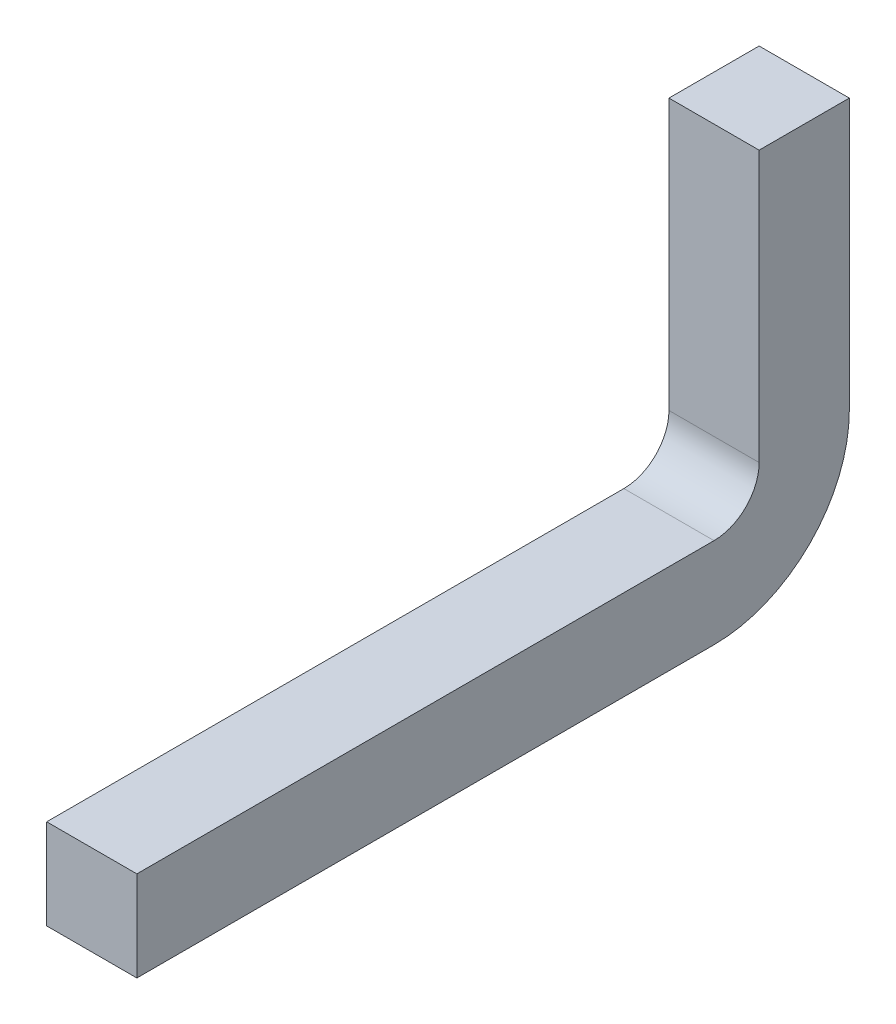
ISO-10303-21;
HEADER;
FILE_DESCRIPTION(('STEP AP214'),'2;1');
FILE_NAME('part.step','',(''),(''),'','','');
FILE_SCHEMA(('AUTOMOTIVE_DESIGN { 1 0 10303 214 1 1 1 1 }'));
ENDSEC;
DATA;
#1=APPLICATION_CONTEXT('core data for automotive mechanical design processes');
#2=APPLICATION_PROTOCOL_DEFINITION('international standard','automotive_design',2000,#1);
#3=PRODUCT_CONTEXT('',#1,'mechanical');
#4=PRODUCT('Part','Part','',(#3));
#5=PRODUCT_RELATED_PRODUCT_CATEGORY('part','',(#4));
#6=PRODUCT_DEFINITION_FORMATION('','',#4);
#7=PRODUCT_DEFINITION_CONTEXT('part definition',#1,'design');
#8=PRODUCT_DEFINITION('design','',#6,#7);
#9=PRODUCT_DEFINITION_SHAPE('','',#8);
#10=(LENGTH_UNIT() NAMED_UNIT(*) SI_UNIT(.MILLI.,.METRE.));
#11=(NAMED_UNIT(*) PLANE_ANGLE_UNIT() SI_UNIT($,.RADIAN.));
#12=(NAMED_UNIT(*) SI_UNIT($,.STERADIAN.) SOLID_ANGLE_UNIT());
#13=UNCERTAINTY_MEASURE_WITH_UNIT(LENGTH_MEASURE(1.E-05),#10,'distance_accuracy_value','');
#14=(GEOMETRIC_REPRESENTATION_CONTEXT(3) GLOBAL_UNCERTAINTY_ASSIGNED_CONTEXT((#13)) GLOBAL_UNIT_ASSIGNED_CONTEXT((#10,
#11,#12)) REPRESENTATION_CONTEXT('',''));
#15=CARTESIAN_POINT('',(0.,0.,0.));
#16=DIRECTION('',(0.,0.,1.));
#17=DIRECTION('',(1.,0.,0.));
#18=AXIS2_PLACEMENT_3D('',#15,#16,#17);
#19=CARTESIAN_POINT('',(0.1,3.914738184594,-0.962544486012));
#20=DIRECTION('',(1.,0.,0.));
#21=DIRECTION('',(0.,1.,0.));
#22=AXIS2_PLACEMENT_3D('',#19,#20,#21);
#23=PLANE('',#22);
#24=DIRECTION('',(0.,-1.,0.));
#25=VECTOR('',#24,1.);
#26=CARTESIAN_POINT('',(0.1,3.65,0.));
#27=LINE('',#26,#25);
#28=CARTESIAN_POINT('',(0.1,3.65,0.));
#29=VERTEX_POINT('',#28);
#30=CARTESIAN_POINT('',(0.1,3.85,0.));
#31=VERTEX_POINT('',#30);
#32=EDGE_CURVE('E106',#29,#31,#27,.F.);
#33=ORIENTED_EDGE('',*,*,#32,.F.);
#34=DIRECTION('',(0.,0.,1.));
#35=VECTOR('',#34,1.);
#36=CARTESIAN_POINT('',(0.1,3.65,-1.28));
#37=LINE('',#36,#35);
#38=CARTESIAN_POINT('',(0.0999999999999999,3.65,-1.28));
#39=VERTEX_POINT('',#38);
#40=EDGE_CURVE('E92',#39,#29,#37,.T.);
#41=ORIENTED_EDGE('',*,*,#40,.F.);
#42=CARTESIAN_POINT('',(0.0999999999999999,3.95,-1.28));
#43=DIRECTION('',(-1.,0.,0.));
#44=DIRECTION('',(0.,0.,1.));
#45=AXIS2_PLACEMENT_3D('',#42,#43,#44);
#46=CIRCLE('',#45,0.3);
#47=CARTESIAN_POINT('',(0.1,3.95,-1.58));
#48=VERTEX_POINT('',#47);
#49=EDGE_CURVE('E20',#48,#39,#46,.T.);
#50=ORIENTED_EDGE('',*,*,#49,.F.);
#51=DIRECTION('',(0.,1.,0.));
#52=VECTOR('',#51,1.);
#53=CARTESIAN_POINT('',(0.1,4.55,-1.58));
#54=LINE('',#53,#52);
#55=CARTESIAN_POINT('',(0.1,4.55,-1.58));
#56=VERTEX_POINT('',#55);
#57=EDGE_CURVE('E78',#56,#48,#54,.F.);
#58=ORIENTED_EDGE('',*,*,#57,.F.);
#59=DIRECTION('',(0.,0.,1.));
#60=VECTOR('',#59,1.);
#61=CARTESIAN_POINT('',(0.1,4.55,-1.38));
#62=LINE('',#61,#60);
#63=CARTESIAN_POINT('',(0.1,4.55,-1.38));
#64=VERTEX_POINT('',#63);
#65=EDGE_CURVE('E99',#64,#56,#62,.F.);
#66=ORIENTED_EDGE('',*,*,#65,.F.);
#67=DIRECTION('',(0.,-1.,0.));
#68=VECTOR('',#67,1.);
#69=CARTESIAN_POINT('',(0.1,3.95,-1.38));
#70=LINE('',#69,#68);
#71=CARTESIAN_POINT('',(0.1,3.95,-1.38));
#72=VERTEX_POINT('',#71);
#73=EDGE_CURVE('E121',#72,#64,#70,.F.);
#74=ORIENTED_EDGE('',*,*,#73,.F.);
#75=CARTESIAN_POINT('',(0.1,3.95,-1.28));
#76=DIRECTION('',(-1.,0.,0.));
#77=DIRECTION('',(0.,0.,1.));
#78=AXIS2_PLACEMENT_3D('',#75,#76,#77);
#79=CIRCLE('',#78,0.1);
#80=CARTESIAN_POINT('',(0.1,3.85,-1.28));
#81=VERTEX_POINT('',#80);
#82=EDGE_CURVE('E118',#72,#81,#79,.T.);
#83=ORIENTED_EDGE('',*,*,#82,.T.);
#84=DIRECTION('',(0.,0.,1.));
#85=VECTOR('',#84,1.);
#86=CARTESIAN_POINT('',(0.1,3.85,0.));
#87=LINE('',#86,#85);
#88=EDGE_CURVE('E116',#31,#81,#87,.F.);
#89=ORIENTED_EDGE('',*,*,#88,.F.);
#90=EDGE_LOOP('',(#33,#41,#50,#58,#66,#74,#83,#89));
#91=FACE_BOUND('',#90,.T.);
#92=ADVANCED_FACE('F17',(#91),#23,.T.);
#93=CARTESIAN_POINT('',(-0.1,3.95,-1.28));
#94=DIRECTION('',(-1.,0.,0.));
#95=DIRECTION('',(0.,0.,1.));
#96=AXIS2_PLACEMENT_3D('',#93,#94,#95);
#97=CYLINDRICAL_SURFACE('',#96,0.3);
#98=ORIENTED_EDGE('',*,*,#49,.T.);
#99=DIRECTION('',(1.,0.,0.));
#100=VECTOR('',#99,1.);
#101=CARTESIAN_POINT('',(-0.1,3.65,-1.28));
#102=LINE('',#101,#100);
#103=CARTESIAN_POINT('',(-0.1,3.65,-1.28));
#104=VERTEX_POINT('',#103);
#105=EDGE_CURVE('E113',#104,#39,#102,.T.);
#106=ORIENTED_EDGE('',*,*,#105,.F.);
#107=CARTESIAN_POINT('',(-0.1,3.95,-1.28));
#108=DIRECTION('',(-1.,0.,0.));
#109=DIRECTION('',(0.,0.,1.));
#110=AXIS2_PLACEMENT_3D('',#107,#108,#109);
#111=CIRCLE('',#110,0.3);
#112=CARTESIAN_POINT('',(-0.1,3.95,-1.58));
#113=VERTEX_POINT('',#112);
#114=EDGE_CURVE('E98',#104,#113,#111,.F.);
#115=ORIENTED_EDGE('',*,*,#114,.T.);
#116=DIRECTION('',(1.,0.,0.));
#117=VECTOR('',#116,1.);
#118=CARTESIAN_POINT('',(-0.1,3.95,-1.58));
#119=LINE('',#118,#117);
#120=EDGE_CURVE('E83',#48,#113,#119,.F.);
#121=ORIENTED_EDGE('',*,*,#120,.F.);
#122=EDGE_LOOP('',(#98,#106,#115,#121));
#123=FACE_BOUND('',#122,.T.);
#124=ADVANCED_FACE('F97',(#123),#97,.T.);
#125=CARTESIAN_POINT('',(-0.1,4.55,-1.58));
#126=DIRECTION('',(0.,0.,-1.));
#127=DIRECTION('',(0.,1.,0.));
#128=AXIS2_PLACEMENT_3D('',#125,#126,#127);
#129=PLANE('',#128);
#130=ORIENTED_EDGE('',*,*,#120,.T.);
#131=DIRECTION('',(0.,1.,0.));
#132=VECTOR('',#131,1.);
#133=CARTESIAN_POINT('',(-0.1,3.914738184594,-1.58));
#134=LINE('',#133,#132);
#135=CARTESIAN_POINT('',(-0.0999999999999999,4.55,-1.58));
#136=VERTEX_POINT('',#135);
#137=EDGE_CURVE('E135',#113,#136,#134,.T.);
#138=ORIENTED_EDGE('',*,*,#137,.T.);
#139=DIRECTION('',(-1.,0.,0.));
#140=VECTOR('',#139,1.);
#141=CARTESIAN_POINT('',(-0.1,4.55,-1.58));
#142=LINE('',#141,#140);
#143=EDGE_CURVE('E85',#56,#136,#142,.T.);
#144=ORIENTED_EDGE('',*,*,#143,.F.);
#145=ORIENTED_EDGE('',*,*,#57,.T.);
#146=EDGE_LOOP('',(#130,#138,#144,#145));
#147=FACE_BOUND('',#146,.T.);
#148=ADVANCED_FACE('F80',(#147),#129,.T.);
#149=CARTESIAN_POINT('',(-0.1,4.55,-1.38));
#150=DIRECTION('',(0.,1.,0.));
#151=DIRECTION('',(-1.,0.,0.));
#152=AXIS2_PLACEMENT_3D('',#149,#150,#151);
#153=PLANE('',#152);
#154=ORIENTED_EDGE('',*,*,#143,.T.);
#155=DIRECTION('',(0.,0.,1.));
#156=VECTOR('',#155,1.);
#157=CARTESIAN_POINT('',(-0.0999999999999999,4.55,-0.962544486012));
#158=LINE('',#157,#156);
#159=CARTESIAN_POINT('',(-0.0999999999999999,4.55,-1.38));
#160=VERTEX_POINT('',#159);
#161=EDGE_CURVE('E151',#136,#160,#158,.T.);
#162=ORIENTED_EDGE('',*,*,#161,.T.);
#163=DIRECTION('',(1.,0.,0.));
#164=VECTOR('',#163,1.);
#165=CARTESIAN_POINT('',(-0.1,4.55,-1.38));
#166=LINE('',#165,#164);
#167=EDGE_CURVE('E123',#64,#160,#166,.F.);
#168=ORIENTED_EDGE('',*,*,#167,.F.);
#169=ORIENTED_EDGE('',*,*,#65,.T.);
#170=EDGE_LOOP('',(#154,#162,#168,#169));
#171=FACE_BOUND('',#170,.T.);
#172=ADVANCED_FACE('F157',(#171),#153,.T.);
#173=CARTESIAN_POINT('',(-0.1,3.95,-1.38));
#174=DIRECTION('',(0.,0.,1.));
#175=DIRECTION('',(0.,-1.,0.));
#176=AXIS2_PLACEMENT_3D('',#173,#174,#175);
#177=PLANE('',#176);
#178=ORIENTED_EDGE('',*,*,#167,.T.);
#179=DIRECTION('',(0.,1.,0.));
#180=VECTOR('',#179,1.);
#181=CARTESIAN_POINT('',(-0.1,3.914738184594,-1.38));
#182=LINE('',#181,#180);
#183=CARTESIAN_POINT('',(-0.1,3.95,-1.38));
#184=VERTEX_POINT('',#183);
#185=EDGE_CURVE('E134',#160,#184,#182,.F.);
#186=ORIENTED_EDGE('',*,*,#185,.T.);
#187=DIRECTION('',(-1.,0.,0.));
#188=VECTOR('',#187,1.);
#189=CARTESIAN_POINT('',(-0.1,3.95,-1.38));
#190=LINE('',#189,#188);
#191=EDGE_CURVE('E137',#184,#72,#190,.F.);
#192=ORIENTED_EDGE('',*,*,#191,.T.);
#193=ORIENTED_EDGE('',*,*,#73,.T.);
#194=EDGE_LOOP('',(#178,#186,#192,#193));
#195=FACE_BOUND('',#194,.T.);
#196=ADVANCED_FACE('F192',(#195),#177,.T.);
#197=CARTESIAN_POINT('',(-0.1,3.95,-1.28));
#198=DIRECTION('',(-1.,0.,0.));
#199=DIRECTION('',(0.,0.,1.));
#200=AXIS2_PLACEMENT_3D('',#197,#198,#199);
#201=CYLINDRICAL_SURFACE('',#200,0.1);
#202=ORIENTED_EDGE('',*,*,#82,.F.);
#203=ORIENTED_EDGE('',*,*,#191,.F.);
#204=CARTESIAN_POINT('',(-0.1,3.95,-1.28));
#205=DIRECTION('',(-1.,0.,0.));
#206=DIRECTION('',(0.,0.,1.));
#207=AXIS2_PLACEMENT_3D('',#204,#205,#206);
#208=CIRCLE('',#207,0.1);
#209=CARTESIAN_POINT('',(-0.1,3.85,-1.28));
#210=VERTEX_POINT('',#209);
#211=EDGE_CURVE('E130',#184,#210,#208,.T.);
#212=ORIENTED_EDGE('',*,*,#211,.T.);
#213=DIRECTION('',(-1.,0.,0.));
#214=VECTOR('',#213,1.);
#215=CARTESIAN_POINT('',(-0.1,3.85,-1.28));
#216=LINE('',#215,#214);
#217=EDGE_CURVE('E109',#81,#210,#216,.T.);
#218=ORIENTED_EDGE('',*,*,#217,.F.);
#219=EDGE_LOOP('',(#202,#203,#212,#218));
#220=FACE_BOUND('',#219,.T.);
#221=ADVANCED_FACE('F194',(#220),#201,.F.);
#222=CARTESIAN_POINT('',(-0.1,3.85,0.));
#223=DIRECTION('',(0.,1.,0.));
#224=DIRECTION('',(-1.,0.,0.));
#225=AXIS2_PLACEMENT_3D('',#222,#223,#224);
#226=PLANE('',#225);
#227=ORIENTED_EDGE('',*,*,#217,.T.);
#228=DIRECTION('',(0.,0.,1.));
#229=VECTOR('',#228,1.);
#230=CARTESIAN_POINT('',(-0.1,3.85,-0.962544486012));
#231=LINE('',#230,#229);
#232=CARTESIAN_POINT('',(-0.0999999999999999,3.85,0.));
#233=VERTEX_POINT('',#232);
#234=EDGE_CURVE('E133',#210,#233,#231,.T.);
#235=ORIENTED_EDGE('',*,*,#234,.T.);
#236=DIRECTION('',(1.,0.,0.));
#237=VECTOR('',#236,1.);
#238=CARTESIAN_POINT('',(-0.1,3.85,0.));
#239=LINE('',#238,#237);
#240=EDGE_CURVE('E108',#31,#233,#239,.F.);
#241=ORIENTED_EDGE('',*,*,#240,.F.);
#242=ORIENTED_EDGE('',*,*,#88,.T.);
#243=EDGE_LOOP('',(#227,#235,#241,#242));
#244=FACE_BOUND('',#243,.T.);
#245=ADVANCED_FACE('F186',(#244),#226,.T.);
#246=CARTESIAN_POINT('',(-0.1,3.65,0.));
#247=DIRECTION('',(0.,0.,1.));
#248=DIRECTION('',(0.,-1.,0.));
#249=AXIS2_PLACEMENT_3D('',#246,#247,#248);
#250=PLANE('',#249);
#251=ORIENTED_EDGE('',*,*,#240,.T.);
#252=DIRECTION('',(0.,1.,0.));
#253=VECTOR('',#252,1.);
#254=CARTESIAN_POINT('',(-0.0999999999999999,3.914738184594,0.));
#255=LINE('',#254,#253);
#256=CARTESIAN_POINT('',(-0.1,3.65,0.));
#257=VERTEX_POINT('',#256);
#258=EDGE_CURVE('E26',#233,#257,#255,.F.);
#259=ORIENTED_EDGE('',*,*,#258,.T.);
#260=DIRECTION('',(1.,0.,0.));
#261=VECTOR('',#260,1.);
#262=CARTESIAN_POINT('',(-0.1,3.65,0.));
#263=LINE('',#262,#261);
#264=EDGE_CURVE('E34',#29,#257,#263,.F.);
#265=ORIENTED_EDGE('',*,*,#264,.F.);
#266=ORIENTED_EDGE('',*,*,#32,.T.);
#267=EDGE_LOOP('',(#251,#259,#265,#266));
#268=FACE_BOUND('',#267,.T.);
#269=ADVANCED_FACE('F182',(#268),#250,.T.);
#270=CARTESIAN_POINT('',(-0.1,3.65,-1.28));
#271=DIRECTION('',(0.,-1.,0.));
#272=DIRECTION('',(1.,0.,0.));
#273=AXIS2_PLACEMENT_3D('',#270,#271,#272);
#274=PLANE('',#273);
#275=ORIENTED_EDGE('',*,*,#264,.T.);
#276=DIRECTION('',(0.,0.,1.));
#277=VECTOR('',#276,1.);
#278=CARTESIAN_POINT('',(-0.1,3.65,-0.962544486012));
#279=LINE('',#278,#277);
#280=EDGE_CURVE('E11',#257,#104,#279,.F.);
#281=ORIENTED_EDGE('',*,*,#280,.T.);
#282=ORIENTED_EDGE('',*,*,#105,.T.);
#283=ORIENTED_EDGE('',*,*,#40,.T.);
#284=EDGE_LOOP('',(#275,#281,#282,#283));
#285=FACE_BOUND('',#284,.T.);
#286=ADVANCED_FACE('F205',(#285),#274,.T.);
#287=CARTESIAN_POINT('',(-0.1,3.914738184594,-0.962544486012));
#288=DIRECTION('',(1.,0.,0.));
#289=DIRECTION('',(0.,1.,0.));
#290=AXIS2_PLACEMENT_3D('',#287,#288,#289);
#291=PLANE('',#290);
#292=ORIENTED_EDGE('',*,*,#258,.F.);
#293=ORIENTED_EDGE('',*,*,#234,.F.);
#294=ORIENTED_EDGE('',*,*,#211,.F.);
#295=ORIENTED_EDGE('',*,*,#185,.F.);
#296=ORIENTED_EDGE('',*,*,#161,.F.);
#297=ORIENTED_EDGE('',*,*,#137,.F.);
#298=ORIENTED_EDGE('',*,*,#114,.F.);
#299=ORIENTED_EDGE('',*,*,#280,.F.);
#300=EDGE_LOOP('',(#292,#293,#294,#295,#296,#297,#298,#299));
#301=FACE_BOUND('',#300,.T.);
#302=ADVANCED_FACE('F162',(#301),#291,.F.);
#303=CLOSED_SHELL('',(#92,#124,#148,#172,#196,#221,#245,#269,#286,#302));
#304=MANIFOLD_SOLID_BREP('B1',#303);
#305=ADVANCED_BREP_SHAPE_REPRESENTATION('',(#18,#304),#14);
#306=SHAPE_DEFINITION_REPRESENTATION(#9,#305);
ENDSEC;
END-ISO-10303-21;
